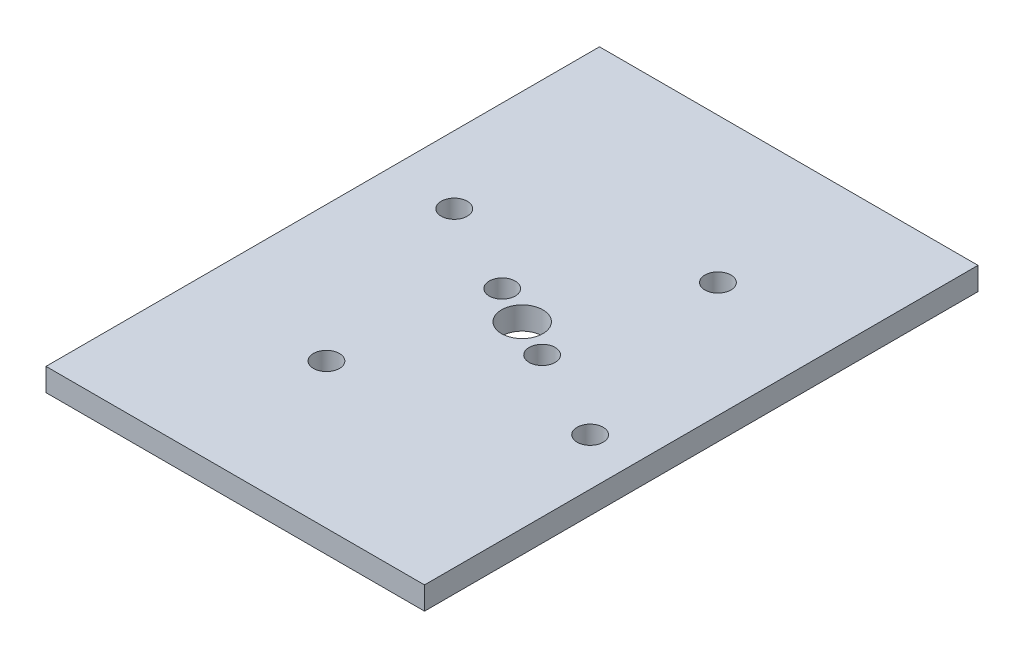
ISO-10303-21;
HEADER;
FILE_DESCRIPTION(('STEP AP214'),'2;1');
FILE_NAME('part.step','',(''),(''),'','','');
FILE_SCHEMA(('AUTOMOTIVE_DESIGN { 1 0 10303 214 1 1 1 1 }'));
ENDSEC;
DATA;
#1=APPLICATION_CONTEXT('core data for automotive mechanical design processes');
#2=APPLICATION_PROTOCOL_DEFINITION('international standard','automotive_design',2000,#1);
#3=PRODUCT_CONTEXT('',#1,'mechanical');
#4=PRODUCT('Part','Part','',(#3));
#5=PRODUCT_RELATED_PRODUCT_CATEGORY('part','',(#4));
#6=PRODUCT_DEFINITION_FORMATION('','',#4);
#7=PRODUCT_DEFINITION_CONTEXT('part definition',#1,'design');
#8=PRODUCT_DEFINITION('design','',#6,#7);
#9=PRODUCT_DEFINITION_SHAPE('','',#8);
#10=(LENGTH_UNIT() NAMED_UNIT(*) SI_UNIT(.MILLI.,.METRE.));
#11=(NAMED_UNIT(*) PLANE_ANGLE_UNIT() SI_UNIT($,.RADIAN.));
#12=(NAMED_UNIT(*) SI_UNIT($,.STERADIAN.) SOLID_ANGLE_UNIT());
#13=UNCERTAINTY_MEASURE_WITH_UNIT(LENGTH_MEASURE(1.E-05),#10,'distance_accuracy_value','');
#14=(GEOMETRIC_REPRESENTATION_CONTEXT(3) GLOBAL_UNCERTAINTY_ASSIGNED_CONTEXT((#13)) GLOBAL_UNIT_ASSIGNED_CONTEXT((#10,
#11,#12)) REPRESENTATION_CONTEXT('',''));
#15=CARTESIAN_POINT('',(0.,0.,0.));
#16=DIRECTION('',(0.,0.,1.));
#17=DIRECTION('',(1.,0.,0.));
#18=AXIS2_PLACEMENT_3D('',#15,#16,#17);
#19=CARTESIAN_POINT('',(27.5,3.5,42.5));
#20=DIRECTION('',(0.,1.,0.));
#21=DIRECTION('',(0.,0.,1.));
#22=AXIS2_PLACEMENT_3D('',#19,#20,#21);
#23=PLANE('',#22);
#24=CARTESIAN_POINT('',(-20.2470066784747,3.5,-9.81370065580709));
#25=DIRECTION('',(0.,1.,0.));
#26=DIRECTION('',(0.,0.,1.));
#27=AXIS2_PLACEMENT_3D('',#24,#25,#26);
#28=CIRCLE('',#27,2.);
#29=CARTESIAN_POINT('',(-20.2470066784747,3.5,-7.81370065580709));
#30=VERTEX_POINT('',#29);
#31=EDGE_CURVE('E147',#30,#30,#28,.T.);
#32=ORIENTED_EDGE('',*,*,#31,.F.);
#33=EDGE_LOOP('',(#32));
#34=FACE_BOUND('',#33,.T.);
#35=CARTESIAN_POINT('',(-9.813700655807,3.5,20.2470066784751));
#36=DIRECTION('',(0.,1.,0.));
#37=DIRECTION('',(0.,0.,1.));
#38=AXIS2_PLACEMENT_3D('',#35,#36,#37);
#39=CIRCLE('',#38,2.);
#40=CARTESIAN_POINT('',(-9.813700655807,3.5,22.2470066784751));
#41=VERTEX_POINT('',#40);
#42=EDGE_CURVE('E141',#41,#41,#39,.T.);
#43=ORIENTED_EDGE('',*,*,#42,.F.);
#44=EDGE_LOOP('',(#43));
#45=FACE_BOUND('',#44,.T.);
#46=CARTESIAN_POINT('',(9.81370065580747,3.5,-20.2470066784748));
#47=DIRECTION('',(0.,1.,0.));
#48=DIRECTION('',(0.,0.,1.));
#49=AXIS2_PLACEMENT_3D('',#46,#47,#48);
#50=CIRCLE('',#49,2.);
#51=CARTESIAN_POINT('',(9.81370065580747,3.5,-18.2470066784748));
#52=VERTEX_POINT('',#51);
#53=EDGE_CURVE('E135',#52,#52,#50,.T.);
#54=ORIENTED_EDGE('',*,*,#53,.F.);
#55=EDGE_LOOP('',(#54));
#56=FACE_BOUND('',#55,.T.);
#57=CARTESIAN_POINT('',(20.2470066784748,3.5,9.81370065580759));
#58=DIRECTION('',(0.,1.,0.));
#59=DIRECTION('',(0.,0.,1.));
#60=AXIS2_PLACEMENT_3D('',#57,#58,#59);
#61=CIRCLE('',#60,2.);
#62=CARTESIAN_POINT('',(20.2470066784748,3.5,11.8137006558076));
#63=VERTEX_POINT('',#62);
#64=EDGE_CURVE('E129',#63,#63,#61,.T.);
#65=ORIENTED_EDGE('',*,*,#64,.F.);
#66=EDGE_LOOP('',(#65));
#67=FACE_BOUND('',#66,.T.);
#68=CARTESIAN_POINT('',(5.94581969559909,3.5,2.88193191085618));
#69=DIRECTION('',(0.,1.,0.));
#70=DIRECTION('',(0.,0.,1.));
#71=AXIS2_PLACEMENT_3D('',#68,#69,#70);
#72=CIRCLE('',#71,1.99999999999998);
#73=CARTESIAN_POINT('',(5.94581969559909,3.5,4.88193191085615));
#74=VERTEX_POINT('',#73);
#75=EDGE_CURVE('E123',#74,#74,#72,.T.);
#76=ORIENTED_EDGE('',*,*,#75,.F.);
#77=EDGE_LOOP('',(#76));
#78=FACE_BOUND('',#77,.T.);
#79=CARTESIAN_POINT('',(-5.9458196955992,3.5,-2.88193191085616));
#80=DIRECTION('',(0.,1.,0.));
#81=DIRECTION('',(0.,0.,1.));
#82=AXIS2_PLACEMENT_3D('',#79,#80,#81);
#83=CIRCLE('',#82,1.99999999999998);
#84=CARTESIAN_POINT('',(-5.9458196955992,3.5,-0.881931910856188));
#85=VERTEX_POINT('',#84);
#86=EDGE_CURVE('E117',#85,#85,#83,.T.);
#87=ORIENTED_EDGE('',*,*,#86,.F.);
#88=EDGE_LOOP('',(#87));
#89=FACE_BOUND('',#88,.T.);
#90=DIRECTION('',(0.,0.,-1.));
#91=VECTOR('',#90,1.);
#92=CARTESIAN_POINT('',(27.5,3.5,-42.5));
#93=LINE('',#92,#91);
#94=CARTESIAN_POINT('',(27.5,3.5,42.5));
#95=VERTEX_POINT('',#94);
#96=CARTESIAN_POINT('',(27.5,3.5,-42.5));
#97=VERTEX_POINT('',#96);
#98=EDGE_CURVE('E84',#95,#97,#93,.T.);
#99=ORIENTED_EDGE('',*,*,#98,.T.);
#100=DIRECTION('',(-1.,0.,0.));
#101=VECTOR('',#100,1.);
#102=CARTESIAN_POINT('',(-30.6287609952603,3.5,-42.5));
#103=LINE('',#102,#101);
#104=CARTESIAN_POINT('',(-30.6287609952603,3.5,-42.5));
#105=VERTEX_POINT('',#104);
#106=EDGE_CURVE('E79',#97,#105,#103,.T.);
#107=ORIENTED_EDGE('',*,*,#106,.T.);
#108=DIRECTION('',(0.,0.,1.));
#109=VECTOR('',#108,1.);
#110=CARTESIAN_POINT('',(-30.6287609952603,3.5,-42.5));
#111=LINE('',#110,#109);
#112=CARTESIAN_POINT('',(-30.6287609952602,3.5,42.5));
#113=VERTEX_POINT('',#112);
#114=EDGE_CURVE('E82',#105,#113,#111,.T.);
#115=ORIENTED_EDGE('',*,*,#114,.T.);
#116=DIRECTION('',(1.,0.,0.));
#117=VECTOR('',#116,1.);
#118=CARTESIAN_POINT('',(-30.6287609952602,3.5,42.5));
#119=LINE('',#118,#117);
#120=EDGE_CURVE('E49',#113,#95,#119,.T.);
#121=ORIENTED_EDGE('',*,*,#120,.T.);
#122=EDGE_LOOP('',(#99,#107,#115,#121));
#123=FACE_BOUND('',#122,.T.);
#124=CARTESIAN_POINT('',(0.,3.5,0.));
#125=DIRECTION('',(0.,1.,0.));
#126=DIRECTION('',(0.,0.,1.));
#127=AXIS2_PLACEMENT_3D('',#124,#125,#126);
#128=CIRCLE('',#127,3.175);
#129=CARTESIAN_POINT('',(0.,3.5,3.17500000000001));
#130=VERTEX_POINT('',#129);
#131=EDGE_CURVE('E99',#130,#130,#128,.T.);
#132=ORIENTED_EDGE('',*,*,#131,.F.);
#133=EDGE_LOOP('',(#132));
#134=FACE_BOUND('',#133,.T.);
#135=ADVANCED_FACE('F32',(#34,#45,#56,#67,#78,#89,#123,#134),#23,.T.);
#136=CARTESIAN_POINT('',(27.5,0.,42.5));
#137=DIRECTION('',(0.,1.,0.));
#138=DIRECTION('',(0.,0.,1.));
#139=AXIS2_PLACEMENT_3D('',#136,#137,#138);
#140=PLANE('',#139);
#141=CARTESIAN_POINT('',(-20.2470066784747,0.,-9.81370065580709));
#142=DIRECTION('',(0.,1.,0.));
#143=DIRECTION('',(0.,0.,1.));
#144=AXIS2_PLACEMENT_3D('',#141,#142,#143);
#145=CIRCLE('',#144,2.);
#146=CARTESIAN_POINT('',(-20.2470066784747,0.,-7.81370065580709));
#147=VERTEX_POINT('',#146);
#148=EDGE_CURVE('E144',#147,#147,#145,.T.);
#149=ORIENTED_EDGE('',*,*,#148,.T.);
#150=EDGE_LOOP('',(#149));
#151=FACE_BOUND('',#150,.T.);
#152=CARTESIAN_POINT('',(-9.813700655807,0.,20.2470066784751));
#153=DIRECTION('',(0.,1.,0.));
#154=DIRECTION('',(0.,0.,1.));
#155=AXIS2_PLACEMENT_3D('',#152,#153,#154);
#156=CIRCLE('',#155,2.);
#157=CARTESIAN_POINT('',(-9.813700655807,0.,22.2470066784751));
#158=VERTEX_POINT('',#157);
#159=EDGE_CURVE('E138',#158,#158,#156,.T.);
#160=ORIENTED_EDGE('',*,*,#159,.T.);
#161=EDGE_LOOP('',(#160));
#162=FACE_BOUND('',#161,.T.);
#163=CARTESIAN_POINT('',(9.81370065580747,0.,-20.2470066784748));
#164=DIRECTION('',(0.,1.,0.));
#165=DIRECTION('',(0.,0.,1.));
#166=AXIS2_PLACEMENT_3D('',#163,#164,#165);
#167=CIRCLE('',#166,2.);
#168=CARTESIAN_POINT('',(9.81370065580747,0.,-18.2470066784748));
#169=VERTEX_POINT('',#168);
#170=EDGE_CURVE('E132',#169,#169,#167,.T.);
#171=ORIENTED_EDGE('',*,*,#170,.T.);
#172=EDGE_LOOP('',(#171));
#173=FACE_BOUND('',#172,.T.);
#174=CARTESIAN_POINT('',(20.2470066784748,0.,9.81370065580759));
#175=DIRECTION('',(0.,1.,0.));
#176=DIRECTION('',(0.,0.,1.));
#177=AXIS2_PLACEMENT_3D('',#174,#175,#176);
#178=CIRCLE('',#177,2.);
#179=CARTESIAN_POINT('',(20.2470066784748,0.,11.8137006558076));
#180=VERTEX_POINT('',#179);
#181=EDGE_CURVE('E126',#180,#180,#178,.T.);
#182=ORIENTED_EDGE('',*,*,#181,.T.);
#183=EDGE_LOOP('',(#182));
#184=FACE_BOUND('',#183,.T.);
#185=CARTESIAN_POINT('',(5.94581969559909,0.,2.88193191085618));
#186=DIRECTION('',(0.,1.,0.));
#187=DIRECTION('',(0.,0.,1.));
#188=AXIS2_PLACEMENT_3D('',#185,#186,#187);
#189=CIRCLE('',#188,1.99999999999998);
#190=CARTESIAN_POINT('',(5.94581969559909,0.,4.88193191085615));
#191=VERTEX_POINT('',#190);
#192=EDGE_CURVE('E120',#191,#191,#189,.T.);
#193=ORIENTED_EDGE('',*,*,#192,.T.);
#194=EDGE_LOOP('',(#193));
#195=FACE_BOUND('',#194,.T.);
#196=CARTESIAN_POINT('',(-5.9458196955992,0.,-2.88193191085616));
#197=DIRECTION('',(0.,1.,0.));
#198=DIRECTION('',(0.,0.,1.));
#199=AXIS2_PLACEMENT_3D('',#196,#197,#198);
#200=CIRCLE('',#199,1.99999999999998);
#201=CARTESIAN_POINT('',(-5.9458196955992,0.,-0.881931910856188));
#202=VERTEX_POINT('',#201);
#203=EDGE_CURVE('E114',#202,#202,#200,.T.);
#204=ORIENTED_EDGE('',*,*,#203,.T.);
#205=EDGE_LOOP('',(#204));
#206=FACE_BOUND('',#205,.T.);
#207=DIRECTION('',(0.,0.,-1.));
#208=VECTOR('',#207,1.);
#209=CARTESIAN_POINT('',(27.5,0.,-42.5));
#210=LINE('',#209,#208);
#211=CARTESIAN_POINT('',(27.5,0.,42.5));
#212=VERTEX_POINT('',#211);
#213=CARTESIAN_POINT('',(27.5,0.,-42.5));
#214=VERTEX_POINT('',#213);
#215=EDGE_CURVE('E96',#212,#214,#210,.T.);
#216=ORIENTED_EDGE('',*,*,#215,.F.);
#217=DIRECTION('',(1.,0.,0.));
#218=VECTOR('',#217,1.);
#219=CARTESIAN_POINT('',(-30.6287609952602,0.,42.5));
#220=LINE('',#219,#218);
#221=CARTESIAN_POINT('',(-30.6287609952602,0.,42.5));
#222=VERTEX_POINT('',#221);
#223=EDGE_CURVE('E72',#222,#212,#220,.T.);
#224=ORIENTED_EDGE('',*,*,#223,.F.);
#225=DIRECTION('',(0.,0.,1.));
#226=VECTOR('',#225,1.);
#227=CARTESIAN_POINT('',(-30.6287609952603,0.,-42.5));
#228=LINE('',#227,#226);
#229=CARTESIAN_POINT('',(-30.6287609952603,0.,-42.5));
#230=VERTEX_POINT('',#229);
#231=EDGE_CURVE('E66',#230,#222,#228,.T.);
#232=ORIENTED_EDGE('',*,*,#231,.F.);
#233=DIRECTION('',(-1.,0.,0.));
#234=VECTOR('',#233,1.);
#235=CARTESIAN_POINT('',(-30.6287609952603,0.,-42.5));
#236=LINE('',#235,#234);
#237=EDGE_CURVE('E88',#214,#230,#236,.T.);
#238=ORIENTED_EDGE('',*,*,#237,.F.);
#239=EDGE_LOOP('',(#216,#224,#232,#238));
#240=FACE_BOUND('',#239,.T.);
#241=CARTESIAN_POINT('',(0.,0.,0.));
#242=DIRECTION('',(0.,1.,0.));
#243=DIRECTION('',(0.,0.,1.));
#244=AXIS2_PLACEMENT_3D('',#241,#242,#243);
#245=CIRCLE('',#244,3.175);
#246=CARTESIAN_POINT('',(0.,0.,3.17500000000001));
#247=VERTEX_POINT('',#246);
#248=EDGE_CURVE('E111',#247,#247,#245,.T.);
#249=ORIENTED_EDGE('',*,*,#248,.T.);
#250=EDGE_LOOP('',(#249));
#251=FACE_BOUND('',#250,.T.);
#252=ADVANCED_FACE('F107',(#151,#162,#173,#184,#195,#206,#240,#251),#140,.F.);
#253=CARTESIAN_POINT('',(27.5,3.5,-42.5));
#254=DIRECTION('',(-1.,0.,0.));
#255=DIRECTION('',(0.,0.,1.));
#256=AXIS2_PLACEMENT_3D('',#253,#254,#255);
#257=PLANE('',#256);
#258=ORIENTED_EDGE('',*,*,#215,.T.);
#259=DIRECTION('',(0.,-1.,0.));
#260=VECTOR('',#259,1.);
#261=CARTESIAN_POINT('',(27.5,3.5,-42.5));
#262=LINE('',#261,#260);
#263=EDGE_CURVE('E11',#97,#214,#262,.T.);
#264=ORIENTED_EDGE('',*,*,#263,.F.);
#265=ORIENTED_EDGE('',*,*,#98,.F.);
#266=DIRECTION('',(0.,-1.,0.));
#267=VECTOR('',#266,1.);
#268=CARTESIAN_POINT('',(27.5,3.5,42.5));
#269=LINE('',#268,#267);
#270=EDGE_CURVE('E92',#95,#212,#269,.T.);
#271=ORIENTED_EDGE('',*,*,#270,.T.);
#272=EDGE_LOOP('',(#258,#264,#265,#271));
#273=FACE_BOUND('',#272,.T.);
#274=ADVANCED_FACE('F34',(#273),#257,.F.);
#275=CARTESIAN_POINT('',(-30.6287609952603,3.5,-42.5));
#276=DIRECTION('',(0.,0.,1.));
#277=DIRECTION('',(1.,0.,0.));
#278=AXIS2_PLACEMENT_3D('',#275,#276,#277);
#279=PLANE('',#278);
#280=ORIENTED_EDGE('',*,*,#237,.T.);
#281=DIRECTION('',(0.,-1.,0.));
#282=VECTOR('',#281,1.);
#283=CARTESIAN_POINT('',(-30.6287609952603,3.5,-42.5));
#284=LINE('',#283,#282);
#285=EDGE_CURVE('E41',#105,#230,#284,.T.);
#286=ORIENTED_EDGE('',*,*,#285,.F.);
#287=ORIENTED_EDGE('',*,*,#106,.F.);
#288=ORIENTED_EDGE('',*,*,#263,.T.);
#289=EDGE_LOOP('',(#280,#286,#287,#288));
#290=FACE_BOUND('',#289,.T.);
#291=ADVANCED_FACE('F87',(#290),#279,.F.);
#292=CARTESIAN_POINT('',(-30.6287609952603,3.5,-42.5));
#293=DIRECTION('',(1.,0.,0.));
#294=DIRECTION('',(0.,0.,-1.));
#295=AXIS2_PLACEMENT_3D('',#292,#293,#294);
#296=PLANE('',#295);
#297=ORIENTED_EDGE('',*,*,#231,.T.);
#298=DIRECTION('',(0.,-1.,0.));
#299=VECTOR('',#298,1.);
#300=CARTESIAN_POINT('',(-30.6287609952602,3.5,42.5));
#301=LINE('',#300,#299);
#302=EDGE_CURVE('E89',#113,#222,#301,.T.);
#303=ORIENTED_EDGE('',*,*,#302,.F.);
#304=ORIENTED_EDGE('',*,*,#114,.F.);
#305=ORIENTED_EDGE('',*,*,#285,.T.);
#306=EDGE_LOOP('',(#297,#303,#304,#305));
#307=FACE_BOUND('',#306,.T.);
#308=ADVANCED_FACE('F90',(#307),#296,.F.);
#309=CARTESIAN_POINT('',(-30.6287609952602,3.5,42.5));
#310=DIRECTION('',(0.,0.,-1.));
#311=DIRECTION('',(-1.,0.,0.));
#312=AXIS2_PLACEMENT_3D('',#309,#310,#311);
#313=PLANE('',#312);
#314=ORIENTED_EDGE('',*,*,#223,.T.);
#315=ORIENTED_EDGE('',*,*,#270,.F.);
#316=ORIENTED_EDGE('',*,*,#120,.F.);
#317=ORIENTED_EDGE('',*,*,#302,.T.);
#318=EDGE_LOOP('',(#314,#315,#316,#317));
#319=FACE_BOUND('',#318,.T.);
#320=ADVANCED_FACE('F104',(#319),#313,.F.);
#321=CARTESIAN_POINT('',(0.,3.5,0.));
#322=DIRECTION('',(0.,-1.,0.));
#323=DIRECTION('',(0.,0.,-1.));
#324=AXIS2_PLACEMENT_3D('',#321,#322,#323);
#325=CYLINDRICAL_SURFACE('',#324,3.175);
#326=ORIENTED_EDGE('',*,*,#131,.T.);
#327=EDGE_LOOP('',(#326));
#328=FACE_BOUND('',#327,.T.);
#329=ORIENTED_EDGE('',*,*,#248,.F.);
#330=EDGE_LOOP('',(#329));
#331=FACE_BOUND('',#330,.T.);
#332=ADVANCED_FACE('F178',(#328,#331),#325,.F.);
#333=CARTESIAN_POINT('',(-5.9458196955992,0.,-2.88193191085616));
#334=DIRECTION('',(0.,1.,0.));
#335=DIRECTION('',(0.,0.,1.));
#336=AXIS2_PLACEMENT_3D('',#333,#334,#335);
#337=CYLINDRICAL_SURFACE('',#336,1.99999999999998);
#338=ORIENTED_EDGE('',*,*,#203,.F.);
#339=EDGE_LOOP('',(#338));
#340=FACE_BOUND('',#339,.T.);
#341=ORIENTED_EDGE('',*,*,#86,.T.);
#342=EDGE_LOOP('',(#341));
#343=FACE_BOUND('',#342,.T.);
#344=ADVANCED_FACE('F175',(#340,#343),#337,.F.);
#345=CARTESIAN_POINT('',(5.94581969559909,0.,2.88193191085618));
#346=DIRECTION('',(0.,1.,0.));
#347=DIRECTION('',(0.,0.,1.));
#348=AXIS2_PLACEMENT_3D('',#345,#346,#347);
#349=CYLINDRICAL_SURFACE('',#348,1.99999999999998);
#350=ORIENTED_EDGE('',*,*,#192,.F.);
#351=EDGE_LOOP('',(#350));
#352=FACE_BOUND('',#351,.T.);
#353=ORIENTED_EDGE('',*,*,#75,.T.);
#354=EDGE_LOOP('',(#353));
#355=FACE_BOUND('',#354,.T.);
#356=ADVANCED_FACE('F177',(#352,#355),#349,.F.);
#357=CARTESIAN_POINT('',(20.2470066784748,0.,9.81370065580759));
#358=DIRECTION('',(0.,1.,0.));
#359=DIRECTION('',(0.,0.,1.));
#360=AXIS2_PLACEMENT_3D('',#357,#358,#359);
#361=CYLINDRICAL_SURFACE('',#360,2.);
#362=ORIENTED_EDGE('',*,*,#181,.F.);
#363=EDGE_LOOP('',(#362));
#364=FACE_BOUND('',#363,.T.);
#365=ORIENTED_EDGE('',*,*,#64,.T.);
#366=EDGE_LOOP('',(#365));
#367=FACE_BOUND('',#366,.T.);
#368=ADVANCED_FACE('F185',(#364,#367),#361,.F.);
#369=CARTESIAN_POINT('',(9.81370065580747,0.,-20.2470066784748));
#370=DIRECTION('',(0.,1.,0.));
#371=DIRECTION('',(0.,0.,1.));
#372=AXIS2_PLACEMENT_3D('',#369,#370,#371);
#373=CYLINDRICAL_SURFACE('',#372,2.);
#374=ORIENTED_EDGE('',*,*,#170,.F.);
#375=EDGE_LOOP('',(#374));
#376=FACE_BOUND('',#375,.T.);
#377=ORIENTED_EDGE('',*,*,#53,.T.);
#378=EDGE_LOOP('',(#377));
#379=FACE_BOUND('',#378,.T.);
#380=ADVANCED_FACE('F257',(#376,#379),#373,.F.);
#381=CARTESIAN_POINT('',(-9.813700655807,0.,20.2470066784751));
#382=DIRECTION('',(0.,1.,0.));
#383=DIRECTION('',(0.,0.,1.));
#384=AXIS2_PLACEMENT_3D('',#381,#382,#383);
#385=CYLINDRICAL_SURFACE('',#384,2.);
#386=ORIENTED_EDGE('',*,*,#159,.F.);
#387=EDGE_LOOP('',(#386));
#388=FACE_BOUND('',#387,.T.);
#389=ORIENTED_EDGE('',*,*,#42,.T.);
#390=EDGE_LOOP('',(#389));
#391=FACE_BOUND('',#390,.T.);
#392=ADVANCED_FACE('F158',(#388,#391),#385,.F.);
#393=CARTESIAN_POINT('',(-20.2470066784747,0.,-9.81370065580709));
#394=DIRECTION('',(0.,1.,0.));
#395=DIRECTION('',(0.,0.,1.));
#396=AXIS2_PLACEMENT_3D('',#393,#394,#395);
#397=CYLINDRICAL_SURFACE('',#396,2.);
#398=ORIENTED_EDGE('',*,*,#148,.F.);
#399=EDGE_LOOP('',(#398));
#400=FACE_BOUND('',#399,.T.);
#401=ORIENTED_EDGE('',*,*,#31,.T.);
#402=EDGE_LOOP('',(#401));
#403=FACE_BOUND('',#402,.T.);
#404=ADVANCED_FACE('F155',(#400,#403),#397,.F.);
#405=CLOSED_SHELL('',(#135,#252,#274,#291,#308,#320,#332,#344,#356,#368,#380,#392,#404));
#406=MANIFOLD_SOLID_BREP('B2',#405);
#407=ADVANCED_BREP_SHAPE_REPRESENTATION('',(#18,#406),#14);
#408=SHAPE_DEFINITION_REPRESENTATION(#9,#407);
ENDSEC;
END-ISO-10303-21;
